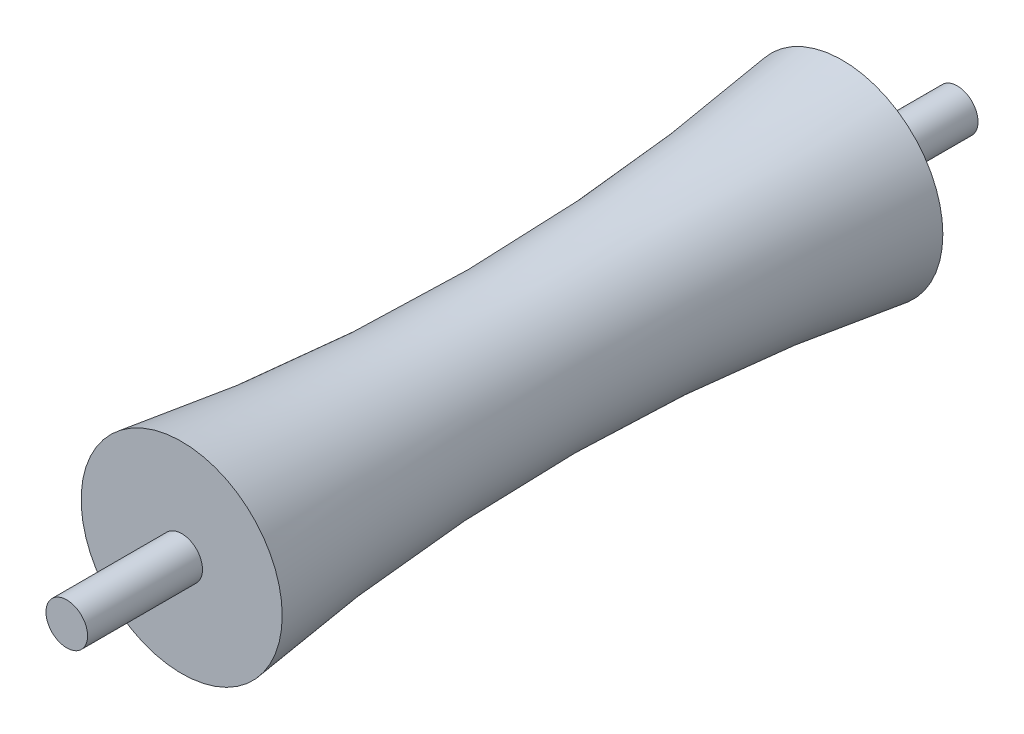
ISO-10303-21;
HEADER;
FILE_DESCRIPTION(('STEP AP214'),'2;1');
FILE_NAME('part.step','',(''),(''),'','','');
FILE_SCHEMA(('AUTOMOTIVE_DESIGN { 1 0 10303 214 1 1 1 1 }'));
ENDSEC;
DATA;
#1=APPLICATION_CONTEXT('core data for automotive mechanical design processes');
#2=APPLICATION_PROTOCOL_DEFINITION('international standard','automotive_design',2000,#1);
#3=PRODUCT_CONTEXT('',#1,'mechanical');
#4=PRODUCT('Part','Part','',(#3));
#5=PRODUCT_RELATED_PRODUCT_CATEGORY('part','',(#4));
#6=PRODUCT_DEFINITION_FORMATION('','',#4);
#7=PRODUCT_DEFINITION_CONTEXT('part definition',#1,'design');
#8=PRODUCT_DEFINITION('design','',#6,#7);
#9=PRODUCT_DEFINITION_SHAPE('','',#8);
#10=(LENGTH_UNIT() NAMED_UNIT(*) SI_UNIT(.MILLI.,.METRE.));
#11=(NAMED_UNIT(*) PLANE_ANGLE_UNIT() SI_UNIT($,.RADIAN.));
#12=(NAMED_UNIT(*) SI_UNIT($,.STERADIAN.) SOLID_ANGLE_UNIT());
#13=UNCERTAINTY_MEASURE_WITH_UNIT(LENGTH_MEASURE(1.E-05),#10,'distance_accuracy_value','');
#14=(GEOMETRIC_REPRESENTATION_CONTEXT(3) GLOBAL_UNCERTAINTY_ASSIGNED_CONTEXT((#13)) GLOBAL_UNIT_ASSIGNED_CONTEXT((#10,
#11,#12)) REPRESENTATION_CONTEXT('',''));
#15=CARTESIAN_POINT('',(0.,0.,0.));
#16=DIRECTION('',(0.,0.,1.));
#17=DIRECTION('',(1.,0.,0.));
#18=AXIS2_PLACEMENT_3D('',#15,#16,#17);
#19=CARTESIAN_POINT('',(0.,0.,0.));
#20=DIRECTION('',(0.,0.,1.));
#21=DIRECTION('',(1.,0.,0.));
#22=AXIS2_PLACEMENT_3D('',#19,#20,#21);
#23=PLANE('',#22);
#24=CARTESIAN_POINT('',(0.,0.,0.));
#25=DIRECTION('',(0.,0.,1.));
#26=DIRECTION('',(1.,0.,0.));
#27=AXIS2_PLACEMENT_3D('',#24,#25,#26);
#28=CIRCLE('',#27,1.45);
#29=CARTESIAN_POINT('',(1.45,0.,0.));
#30=VERTEX_POINT('',#29);
#31=EDGE_CURVE('E42',#30,#30,#28,.T.);
#32=ORIENTED_EDGE('',*,*,#31,.F.);
#33=EDGE_LOOP('',(#32));
#34=FACE_BOUND('',#33,.T.);
#35=CARTESIAN_POINT('',(0.,0.,0.));
#36=DIRECTION('',(0.,0.,1.));
#37=DIRECTION('',(1.,0.,0.));
#38=AXIS2_PLACEMENT_3D('',#35,#36,#37);
#39=CIRCLE('',#38,7.00000000000001);
#40=CARTESIAN_POINT('',(7.00000000000001,0.,0.));
#41=VERTEX_POINT('',#40);
#42=EDGE_CURVE('E53',#41,#41,#39,.T.);
#43=ORIENTED_EDGE('',*,*,#42,.T.);
#44=EDGE_LOOP('',(#43));
#45=FACE_BOUND('',#44,.T.);
#46=ADVANCED_FACE('F35',(#34,#45),#23,.T.);
#47=CARTESIAN_POINT('',(0.,0.,-46.));
#48=DIRECTION('',(0.,0.,-1.));
#49=DIRECTION('',(-1.,0.,0.));
#50=AXIS2_PLACEMENT_3D('',#47,#48,#49);
#51=PLANE('',#50);
#52=CARTESIAN_POINT('',(0.,0.,-46.));
#53=DIRECTION('',(0.,0.,-1.));
#54=DIRECTION('',(-1.,0.,0.));
#55=AXIS2_PLACEMENT_3D('',#52,#53,#54);
#56=CIRCLE('',#55,1.45);
#57=CARTESIAN_POINT('',(-1.45,0.,-46.));
#58=VERTEX_POINT('',#57);
#59=EDGE_CURVE('E10',#58,#58,#56,.T.);
#60=ORIENTED_EDGE('',*,*,#59,.F.);
#61=EDGE_LOOP('',(#60));
#62=FACE_BOUND('',#61,.T.);
#63=CARTESIAN_POINT('',(0.,0.,-46.));
#64=DIRECTION('',(0.,0.,1.));
#65=DIRECTION('',(1.,0.,0.));
#66=AXIS2_PLACEMENT_3D('',#63,#64,#65);
#67=CIRCLE('',#66,7.);
#68=CARTESIAN_POINT('',(7.,0.,-46.));
#69=VERTEX_POINT('',#68);
#70=EDGE_CURVE('E38',#69,#69,#67,.T.);
#71=ORIENTED_EDGE('',*,*,#70,.F.);
#72=EDGE_LOOP('',(#71));
#73=FACE_BOUND('',#72,.T.);
#74=ADVANCED_FACE('F63',(#62,#73),#51,.T.);
#75=CARTESIAN_POINT('',(0.,0.,-23.));
#76=DIRECTION('',(0.,0.,1.));
#77=DIRECTION('',(1.,0.,0.));
#78=AXIS2_PLACEMENT_3D('',#75,#76,#77);
#79=TOROIDAL_SURFACE('',#78,155.226178524578,150.);
#80=ORIENTED_EDGE('',*,*,#70,.T.);
#81=EDGE_LOOP('',(#80));
#82=FACE_BOUND('',#81,.T.);
#83=ORIENTED_EDGE('',*,*,#42,.F.);
#84=EDGE_LOOP('',(#83));
#85=FACE_BOUND('',#84,.T.);
#86=ADVANCED_FACE('F60',(#82,#85),#79,.F.);
#87=CARTESIAN_POINT('',(0.,0.,8.));
#88=DIRECTION('',(0.,0.,-1.));
#89=DIRECTION('',(-1.,0.,0.));
#90=AXIS2_PLACEMENT_3D('',#87,#88,#89);
#91=CYLINDRICAL_SURFACE('',#90,1.45);
#92=CARTESIAN_POINT('',(0.,0.,8.));
#93=DIRECTION('',(0.,0.,1.));
#94=DIRECTION('',(1.,0.,0.));
#95=AXIS2_PLACEMENT_3D('',#92,#93,#94);
#96=CIRCLE('',#95,1.45);
#97=CARTESIAN_POINT('',(1.45,0.,8.));
#98=VERTEX_POINT('',#97);
#99=EDGE_CURVE('E51',#98,#98,#96,.T.);
#100=ORIENTED_EDGE('',*,*,#99,.F.);
#101=EDGE_LOOP('',(#100));
#102=FACE_BOUND('',#101,.T.);
#103=ORIENTED_EDGE('',*,*,#31,.T.);
#104=EDGE_LOOP('',(#103));
#105=FACE_BOUND('',#104,.T.);
#106=ADVANCED_FACE('F70',(#102,#105),#91,.T.);
#107=CARTESIAN_POINT('',(0.,0.,8.));
#108=DIRECTION('',(0.,0.,1.));
#109=DIRECTION('',(1.,0.,0.));
#110=AXIS2_PLACEMENT_3D('',#107,#108,#109);
#111=PLANE('',#110);
#112=ORIENTED_EDGE('',*,*,#99,.T.);
#113=EDGE_LOOP('',(#112));
#114=FACE_BOUND('',#113,.T.);
#115=ADVANCED_FACE('F76',(#114),#111,.T.);
#116=CARTESIAN_POINT('',(0.,0.,-54.));
#117=DIRECTION('',(0.,0.,1.));
#118=DIRECTION('',(1.,0.,0.));
#119=AXIS2_PLACEMENT_3D('',#116,#117,#118);
#120=CYLINDRICAL_SURFACE('',#119,1.45);
#121=CARTESIAN_POINT('',(0.,0.,-54.));
#122=DIRECTION('',(0.,0.,-1.));
#123=DIRECTION('',(-1.,0.,0.));
#124=AXIS2_PLACEMENT_3D('',#121,#122,#123);
#125=CIRCLE('',#124,1.45);
#126=CARTESIAN_POINT('',(-1.45,0.,-54.));
#127=VERTEX_POINT('',#126);
#128=EDGE_CURVE('E50',#127,#127,#125,.T.);
#129=ORIENTED_EDGE('',*,*,#128,.F.);
#130=EDGE_LOOP('',(#129));
#131=FACE_BOUND('',#130,.T.);
#132=ORIENTED_EDGE('',*,*,#59,.T.);
#133=EDGE_LOOP('',(#132));
#134=FACE_BOUND('',#133,.T.);
#135=ADVANCED_FACE('F80',(#131,#134),#120,.T.);
#136=CARTESIAN_POINT('',(0.,0.,-54.));
#137=DIRECTION('',(0.,0.,-1.));
#138=DIRECTION('',(-1.,0.,0.));
#139=AXIS2_PLACEMENT_3D('',#136,#137,#138);
#140=PLANE('',#139);
#141=ORIENTED_EDGE('',*,*,#128,.T.);
#142=EDGE_LOOP('',(#141));
#143=FACE_BOUND('',#142,.T.);
#144=ADVANCED_FACE('F84',(#143),#140,.T.);
#145=CLOSED_SHELL('',(#46,#74,#86,#106,#115,#135,#144));
#146=MANIFOLD_SOLID_BREP('B2',#145);
#147=ADVANCED_BREP_SHAPE_REPRESENTATION('',(#18,#146),#14);
#148=SHAPE_DEFINITION_REPRESENTATION(#9,#147);
ENDSEC;
END-ISO-10303-21;
